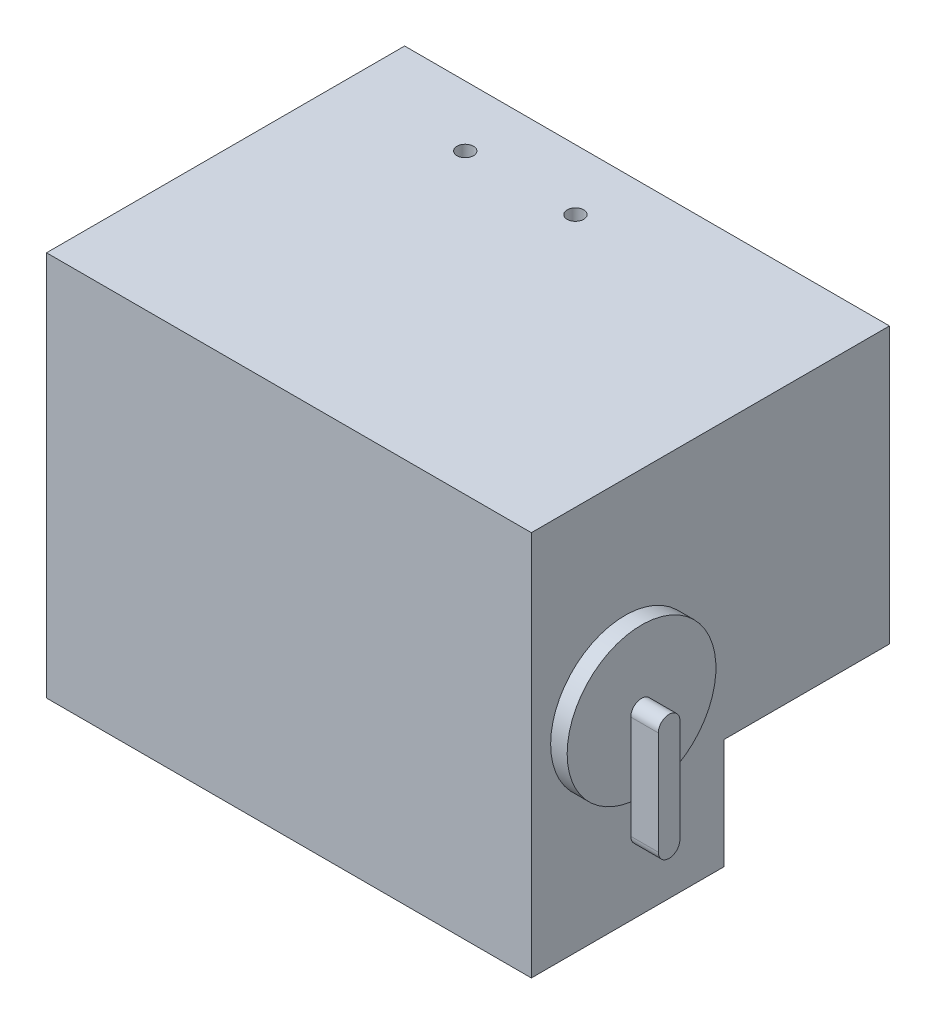
ISO-10303-21;
HEADER;
FILE_DESCRIPTION(('STEP AP214'),'2;1');
FILE_NAME('part.step','',(''),(''),'','','');
FILE_SCHEMA(('AUTOMOTIVE_DESIGN { 1 0 10303 214 1 1 1 1 }'));
ENDSEC;
DATA;
#1=APPLICATION_CONTEXT('core data for automotive mechanical design processes');
#2=APPLICATION_PROTOCOL_DEFINITION('international standard','automotive_design',2000,#1);
#3=PRODUCT_CONTEXT('',#1,'mechanical');
#4=PRODUCT('Part','Part','',(#3));
#5=PRODUCT_RELATED_PRODUCT_CATEGORY('part','',(#4));
#6=PRODUCT_DEFINITION_FORMATION('','',#4);
#7=PRODUCT_DEFINITION_CONTEXT('part definition',#1,'design');
#8=PRODUCT_DEFINITION('design','',#6,#7);
#9=PRODUCT_DEFINITION_SHAPE('','',#8);
#10=(LENGTH_UNIT() NAMED_UNIT(*) SI_UNIT(.MILLI.,.METRE.));
#11=(NAMED_UNIT(*) PLANE_ANGLE_UNIT() SI_UNIT($,.RADIAN.));
#12=(NAMED_UNIT(*) SI_UNIT($,.STERADIAN.) SOLID_ANGLE_UNIT());
#13=UNCERTAINTY_MEASURE_WITH_UNIT(LENGTH_MEASURE(1.E-05),#10,'distance_accuracy_value','');
#14=(GEOMETRIC_REPRESENTATION_CONTEXT(3) GLOBAL_UNCERTAINTY_ASSIGNED_CONTEXT((#13)) GLOBAL_UNIT_ASSIGNED_CONTEXT((#10,
#11,#12)) REPRESENTATION_CONTEXT('',''));
#15=CARTESIAN_POINT('',(0.,0.,0.));
#16=DIRECTION('',(0.,0.,1.));
#17=DIRECTION('',(1.,0.,0.));
#18=AXIS2_PLACEMENT_3D('',#15,#16,#17);
#19=CARTESIAN_POINT('',(47.,0.,18.));
#20=DIRECTION('',(1.,0.,0.));
#21=DIRECTION('',(0.,0.,-1.));
#22=AXIS2_PLACEMENT_3D('',#19,#20,#21);
#23=PLANE('',#22);
#24=CARTESIAN_POINT('',(47.,0.,18.));
#25=DIRECTION('',(1.,0.,0.));
#26=DIRECTION('',(0.,0.,-1.));
#27=AXIS2_PLACEMENT_3D('',#24,#25,#26);
#28=CIRCLE('',#27,1.95720638156463);
#29=CARTESIAN_POINT('',(47.,0.,16.0427936184354));
#30=VERTEX_POINT('',#29);
#31=CARTESIAN_POINT('',(47.,0.,19.9572063815646));
#32=VERTEX_POINT('',#31);
#33=EDGE_CURVE('E62',#30,#32,#28,.T.);
#34=ORIENTED_EDGE('',*,*,#33,.F.);
#35=DIRECTION('',(0.,-1.,0.));
#36=VECTOR('',#35,1.);
#37=CARTESIAN_POINT('',(47.,0.,16.0427936184354));
#38=LINE('',#37,#36);
#39=CARTESIAN_POINT('',(47.,-13.3573703691993,16.0427936184354));
#40=VERTEX_POINT('',#39);
#41=EDGE_CURVE('E147',#30,#40,#38,.T.);
#42=ORIENTED_EDGE('',*,*,#41,.T.);
#43=CARTESIAN_POINT('',(47.,0.,18.));
#44=DIRECTION('',(1.,0.,0.));
#45=DIRECTION('',(0.,0.,-1.));
#46=AXIS2_PLACEMENT_3D('',#43,#44,#45);
#47=CIRCLE('',#46,13.5);
#48=CARTESIAN_POINT('',(47.,-13.3573703691993,19.9572063815646));
#49=VERTEX_POINT('',#48);
#50=EDGE_CURVE('E150',#40,#49,#47,.T.);
#51=ORIENTED_EDGE('',*,*,#50,.T.);
#52=DIRECTION('',(0.,-1.,0.));
#53=VECTOR('',#52,1.);
#54=CARTESIAN_POINT('',(47.,0.,19.9572063815646));
#55=LINE('',#54,#53);
#56=EDGE_CURVE('E67',#32,#49,#55,.T.);
#57=ORIENTED_EDGE('',*,*,#56,.F.);
#58=EDGE_LOOP('',(#34,#42,#51,#57));
#59=FACE_BOUND('',#58,.T.);
#60=ADVANCED_FACE('F47',(#59),#23,.T.);
#61=CARTESIAN_POINT('',(0.,0.,0.));
#62=DIRECTION('',(0.,0.,1.));
#63=DIRECTION('',(1.,0.,0.));
#64=AXIS2_PLACEMENT_3D('',#61,#62,#63);
#65=PLANE('',#64);
#66=DIRECTION('',(-1.,0.,0.));
#67=VECTOR('',#66,1.);
#68=CARTESIAN_POINT('',(44.,-15.,0.));
#69=LINE('',#68,#67);
#70=CARTESIAN_POINT('',(44.,-15.,0.));
#71=VERTEX_POINT('',#70);
#72=CARTESIAN_POINT('',(-44.,-15.,0.));
#73=VERTEX_POINT('',#72);
#74=EDGE_CURVE('E159',#71,#73,#69,.T.);
#75=ORIENTED_EDGE('',*,*,#74,.F.);
#76=DIRECTION('',(0.,1.,0.));
#77=VECTOR('',#76,1.);
#78=CARTESIAN_POINT('',(44.,35.,0.));
#79=LINE('',#78,#77);
#80=CARTESIAN_POINT('',(44.,-35.,0.));
#81=VERTEX_POINT('',#80);
#82=EDGE_CURVE('E179',#81,#71,#79,.T.);
#83=ORIENTED_EDGE('',*,*,#82,.F.);
#84=DIRECTION('',(1.,0.,0.));
#85=VECTOR('',#84,1.);
#86=CARTESIAN_POINT('',(-44.,-35.,0.));
#87=LINE('',#86,#85);
#88=CARTESIAN_POINT('',(-44.,-35.,0.));
#89=VERTEX_POINT('',#88);
#90=EDGE_CURVE('E184',#89,#81,#87,.T.);
#91=ORIENTED_EDGE('',*,*,#90,.F.);
#92=DIRECTION('',(0.,-1.,0.));
#93=VECTOR('',#92,1.);
#94=CARTESIAN_POINT('',(-44.,35.,0.));
#95=LINE('',#94,#93);
#96=EDGE_CURVE('E193',#73,#89,#95,.T.);
#97=ORIENTED_EDGE('',*,*,#96,.F.);
#98=EDGE_LOOP('',(#75,#83,#91,#97));
#99=FACE_BOUND('',#98,.T.);
#100=ADVANCED_FACE('F229',(#99),#65,.F.);
#101=CARTESIAN_POINT('',(44.,35.,35.));
#102=DIRECTION('',(-1.,0.,0.));
#103=DIRECTION('',(0.,0.,1.));
#104=AXIS2_PLACEMENT_3D('',#101,#102,#103);
#105=PLANE('',#104);
#106=CARTESIAN_POINT('',(44.,0.,18.));
#107=DIRECTION('',(-1.,0.,0.));
#108=DIRECTION('',(0.,0.,1.));
#109=AXIS2_PLACEMENT_3D('',#106,#107,#108);
#110=CIRCLE('',#109,13.5);
#111=CARTESIAN_POINT('',(44.,0.,31.5));
#112=VERTEX_POINT('',#111);
#113=EDGE_CURVE('E11',#112,#112,#110,.F.);
#114=ORIENTED_EDGE('',*,*,#113,.F.);
#115=EDGE_LOOP('',(#114));
#116=FACE_BOUND('',#115,.T.);
#117=ORIENTED_EDGE('',*,*,#82,.T.);
#118=DIRECTION('',(0.,0.,1.));
#119=VECTOR('',#118,1.);
#120=CARTESIAN_POINT('',(44.,-15.,-30.));
#121=LINE('',#120,#119);
#122=CARTESIAN_POINT('',(44.,-15.,-30.));
#123=VERTEX_POINT('',#122);
#124=EDGE_CURVE('E176',#123,#71,#121,.T.);
#125=ORIENTED_EDGE('',*,*,#124,.F.);
#126=DIRECTION('',(0.,-1.,0.));
#127=VECTOR('',#126,1.);
#128=CARTESIAN_POINT('',(44.,35.,-30.));
#129=LINE('',#128,#127);
#130=CARTESIAN_POINT('',(44.,35.,-30.));
#131=VERTEX_POINT('',#130);
#132=EDGE_CURVE('E160',#131,#123,#129,.T.);
#133=ORIENTED_EDGE('',*,*,#132,.F.);
#134=DIRECTION('',(0.,0.,-1.));
#135=VECTOR('',#134,1.);
#136=CARTESIAN_POINT('',(44.,35.,35.));
#137=LINE('',#136,#135);
#138=CARTESIAN_POINT('',(44.,35.,35.));
#139=VERTEX_POINT('',#138);
#140=EDGE_CURVE('E55',#139,#131,#137,.T.);
#141=ORIENTED_EDGE('',*,*,#140,.F.);
#142=DIRECTION('',(0.,1.,0.));
#143=VECTOR('',#142,1.);
#144=CARTESIAN_POINT('',(44.,35.,35.));
#145=LINE('',#144,#143);
#146=CARTESIAN_POINT('',(44.,-35.,35.));
#147=VERTEX_POINT('',#146);
#148=EDGE_CURVE('E180',#147,#139,#145,.T.);
#149=ORIENTED_EDGE('',*,*,#148,.F.);
#150=DIRECTION('',(0.,0.,-1.));
#151=VECTOR('',#150,1.);
#152=CARTESIAN_POINT('',(44.,-35.,35.));
#153=LINE('',#152,#151);
#154=EDGE_CURVE('E190',#147,#81,#153,.T.);
#155=ORIENTED_EDGE('',*,*,#154,.T.);
#156=EDGE_LOOP('',(#117,#125,#133,#141,#149,#155));
#157=FACE_BOUND('',#156,.T.);
#158=ADVANCED_FACE('F49',(#116,#157),#105,.F.);
#159=CARTESIAN_POINT('',(-44.,35.,35.));
#160=DIRECTION('',(0.,-1.,0.));
#161=DIRECTION('',(0.,0.,-1.));
#162=AXIS2_PLACEMENT_3D('',#159,#160,#161);
#163=PLANE('',#162);
#164=CARTESIAN_POINT('',(-22.,35.,-19.));
#165=DIRECTION('',(0.,1.,0.));
#166=DIRECTION('',(0.,0.,1.));
#167=AXIS2_PLACEMENT_3D('',#164,#165,#166);
#168=CIRCLE('',#167,1.5);
#169=CARTESIAN_POINT('',(-22.,35.,-17.5));
#170=VERTEX_POINT('',#169);
#171=EDGE_CURVE('E272',#170,#170,#168,.T.);
#172=ORIENTED_EDGE('',*,*,#171,.F.);
#173=EDGE_LOOP('',(#172));
#174=FACE_BOUND('',#173,.T.);
#175=CARTESIAN_POINT('',(-2.00000000000001,35.,-19.));
#176=DIRECTION('',(0.,1.,0.));
#177=DIRECTION('',(0.,0.,1.));
#178=AXIS2_PLACEMENT_3D('',#175,#176,#177);
#179=CIRCLE('',#178,1.5);
#180=CARTESIAN_POINT('',(-2.00000000000001,35.,-17.5));
#181=VERTEX_POINT('',#180);
#182=EDGE_CURVE('E269',#181,#181,#179,.T.);
#183=ORIENTED_EDGE('',*,*,#182,.F.);
#184=EDGE_LOOP('',(#183));
#185=FACE_BOUND('',#184,.T.);
#186=ORIENTED_EDGE('',*,*,#140,.T.);
#187=DIRECTION('',(1.,0.,0.));
#188=VECTOR('',#187,1.);
#189=CARTESIAN_POINT('',(44.,35.,-30.));
#190=LINE('',#189,#188);
#191=CARTESIAN_POINT('',(-44.,35.,-30.));
#192=VERTEX_POINT('',#191);
#193=EDGE_CURVE('E168',#192,#131,#190,.T.);
#194=ORIENTED_EDGE('',*,*,#193,.F.);
#195=DIRECTION('',(0.,0.,-1.));
#196=VECTOR('',#195,1.);
#197=CARTESIAN_POINT('',(-44.,35.,35.));
#198=LINE('',#197,#196);
#199=CARTESIAN_POINT('',(-44.,35.,35.));
#200=VERTEX_POINT('',#199);
#201=EDGE_CURVE('E201',#200,#192,#198,.T.);
#202=ORIENTED_EDGE('',*,*,#201,.F.);
#203=DIRECTION('',(-1.,0.,0.));
#204=VECTOR('',#203,1.);
#205=CARTESIAN_POINT('',(-44.,35.,35.));
#206=LINE('',#205,#204);
#207=EDGE_CURVE('E183',#139,#200,#206,.T.);
#208=ORIENTED_EDGE('',*,*,#207,.F.);
#209=EDGE_LOOP('',(#186,#194,#202,#208));
#210=FACE_BOUND('',#209,.T.);
#211=ADVANCED_FACE('F205',(#174,#185,#210),#163,.F.);
#212=CARTESIAN_POINT('',(-44.,35.,35.));
#213=DIRECTION('',(1.,0.,0.));
#214=DIRECTION('',(0.,0.,-1.));
#215=AXIS2_PLACEMENT_3D('',#212,#213,#214);
#216=PLANE('',#215);
#217=ORIENTED_EDGE('',*,*,#201,.T.);
#218=DIRECTION('',(0.,1.,0.));
#219=VECTOR('',#218,1.);
#220=CARTESIAN_POINT('',(-44.,35.,-30.));
#221=LINE('',#220,#219);
#222=CARTESIAN_POINT('',(-44.,-15.,-30.));
#223=VERTEX_POINT('',#222);
#224=EDGE_CURVE('E165',#223,#192,#221,.T.);
#225=ORIENTED_EDGE('',*,*,#224,.F.);
#226=DIRECTION('',(0.,0.,1.));
#227=VECTOR('',#226,1.);
#228=CARTESIAN_POINT('',(-44.,-15.,-30.));
#229=LINE('',#228,#227);
#230=EDGE_CURVE('E171',#223,#73,#229,.T.);
#231=ORIENTED_EDGE('',*,*,#230,.T.);
#232=ORIENTED_EDGE('',*,*,#96,.T.);
#233=DIRECTION('',(0.,0.,-1.));
#234=VECTOR('',#233,1.);
#235=CARTESIAN_POINT('',(-44.,-35.,35.));
#236=LINE('',#235,#234);
#237=CARTESIAN_POINT('',(-44.,-35.,35.));
#238=VERTEX_POINT('',#237);
#239=EDGE_CURVE('E198',#238,#89,#236,.T.);
#240=ORIENTED_EDGE('',*,*,#239,.F.);
#241=DIRECTION('',(0.,-1.,0.));
#242=VECTOR('',#241,1.);
#243=CARTESIAN_POINT('',(-44.,35.,35.));
#244=LINE('',#243,#242);
#245=EDGE_CURVE('E186',#200,#238,#244,.T.);
#246=ORIENTED_EDGE('',*,*,#245,.F.);
#247=EDGE_LOOP('',(#217,#225,#231,#232,#240,#246));
#248=FACE_BOUND('',#247,.T.);
#249=ADVANCED_FACE('F219',(#248),#216,.F.);
#250=CARTESIAN_POINT('',(-44.,-35.,35.));
#251=DIRECTION('',(0.,1.,0.));
#252=DIRECTION('',(0.,0.,1.));
#253=AXIS2_PLACEMENT_3D('',#250,#251,#252);
#254=PLANE('',#253);
#255=ORIENTED_EDGE('',*,*,#90,.T.);
#256=ORIENTED_EDGE('',*,*,#154,.F.);
#257=DIRECTION('',(1.,0.,0.));
#258=VECTOR('',#257,1.);
#259=CARTESIAN_POINT('',(-44.,-35.,35.));
#260=LINE('',#259,#258);
#261=EDGE_CURVE('E188',#238,#147,#260,.T.);
#262=ORIENTED_EDGE('',*,*,#261,.F.);
#263=ORIENTED_EDGE('',*,*,#239,.T.);
#264=EDGE_LOOP('',(#255,#256,#262,#263));
#265=FACE_BOUND('',#264,.T.);
#266=ADVANCED_FACE('F230',(#265),#254,.F.);
#267=CARTESIAN_POINT('',(0.,0.,35.));
#268=DIRECTION('',(0.,0.,1.));
#269=DIRECTION('',(1.,0.,0.));
#270=AXIS2_PLACEMENT_3D('',#267,#268,#269);
#271=PLANE('',#270);
#272=ORIENTED_EDGE('',*,*,#148,.T.);
#273=ORIENTED_EDGE('',*,*,#207,.T.);
#274=ORIENTED_EDGE('',*,*,#245,.T.);
#275=ORIENTED_EDGE('',*,*,#261,.T.);
#276=EDGE_LOOP('',(#272,#273,#274,#275));
#277=FACE_BOUND('',#276,.T.);
#278=ADVANCED_FACE('F224',(#277),#271,.T.);
#279=CARTESIAN_POINT('',(44.,-15.,-30.));
#280=DIRECTION('',(0.,1.,0.));
#281=DIRECTION('',(0.,0.,1.));
#282=AXIS2_PLACEMENT_3D('',#279,#280,#281);
#283=PLANE('',#282);
#284=CARTESIAN_POINT('',(-22.,-15.,-19.));
#285=DIRECTION('',(0.,1.,0.));
#286=DIRECTION('',(0.,0.,1.));
#287=AXIS2_PLACEMENT_3D('',#284,#285,#286);
#288=CIRCLE('',#287,1.5);
#289=CARTESIAN_POINT('',(-22.,-15.,-17.5));
#290=VERTEX_POINT('',#289);
#291=EDGE_CURVE('E264',#290,#290,#288,.F.);
#292=ORIENTED_EDGE('',*,*,#291,.F.);
#293=EDGE_LOOP('',(#292));
#294=FACE_BOUND('',#293,.T.);
#295=CARTESIAN_POINT('',(-2.00000000000001,-15.,-19.));
#296=DIRECTION('',(0.,1.,0.));
#297=DIRECTION('',(0.,0.,1.));
#298=AXIS2_PLACEMENT_3D('',#295,#296,#297);
#299=CIRCLE('',#298,1.5);
#300=CARTESIAN_POINT('',(-2.00000000000001,-15.,-17.5));
#301=VERTEX_POINT('',#300);
#302=EDGE_CURVE('E267',#301,#301,#299,.F.);
#303=ORIENTED_EDGE('',*,*,#302,.F.);
#304=EDGE_LOOP('',(#303));
#305=FACE_BOUND('',#304,.T.);
#306=ORIENTED_EDGE('',*,*,#74,.T.);
#307=ORIENTED_EDGE('',*,*,#230,.F.);
#308=DIRECTION('',(-1.,0.,0.));
#309=VECTOR('',#308,1.);
#310=CARTESIAN_POINT('',(44.,-15.,-30.));
#311=LINE('',#310,#309);
#312=EDGE_CURVE('E163',#123,#223,#311,.T.);
#313=ORIENTED_EDGE('',*,*,#312,.F.);
#314=ORIENTED_EDGE('',*,*,#124,.T.);
#315=EDGE_LOOP('',(#306,#307,#313,#314));
#316=FACE_BOUND('',#315,.T.);
#317=ADVANCED_FACE('F216',(#294,#305,#316),#283,.F.);
#318=CARTESIAN_POINT('',(0.,0.,-30.));
#319=DIRECTION('',(0.,0.,-1.));
#320=DIRECTION('',(-1.,0.,0.));
#321=AXIS2_PLACEMENT_3D('',#318,#319,#320);
#322=PLANE('',#321);
#323=ORIENTED_EDGE('',*,*,#132,.T.);
#324=ORIENTED_EDGE('',*,*,#312,.T.);
#325=ORIENTED_EDGE('',*,*,#224,.T.);
#326=ORIENTED_EDGE('',*,*,#193,.T.);
#327=EDGE_LOOP('',(#323,#324,#325,#326));
#328=FACE_BOUND('',#327,.T.);
#329=ADVANCED_FACE('F211',(#328),#322,.T.);
#330=CARTESIAN_POINT('',(47.,0.,18.));
#331=DIRECTION('',(-1.,0.,0.));
#332=DIRECTION('',(0.,0.,1.));
#333=AXIS2_PLACEMENT_3D('',#330,#331,#332);
#334=CYLINDRICAL_SURFACE('',#333,13.5);
#335=EDGE_CURVE('E152',#49,#40,#47,.T.);
#336=ORIENTED_EDGE('',*,*,#335,.F.);
#337=ORIENTED_EDGE('',*,*,#50,.F.);
#338=EDGE_LOOP('',(#336,#337));
#339=FACE_BOUND('',#338,.T.);
#340=ORIENTED_EDGE('',*,*,#113,.T.);
#341=EDGE_LOOP('',(#340));
#342=FACE_BOUND('',#341,.T.);
#343=ADVANCED_FACE('F249',(#339,#342),#334,.T.);
#344=CARTESIAN_POINT('',(47.,0.,18.));
#345=DIRECTION('',(1.,0.,0.));
#346=DIRECTION('',(0.,0.,-1.));
#347=AXIS2_PLACEMENT_3D('',#344,#345,#346);
#348=PLANE('',#347);
#349=CARTESIAN_POINT('',(47.,-18.740555957905,19.9572063815646));
#350=VERTEX_POINT('',#349);
#351=EDGE_CURVE('E281',#49,#350,#55,.T.);
#352=ORIENTED_EDGE('',*,*,#351,.F.);
#353=ORIENTED_EDGE('',*,*,#335,.T.);
#354=CARTESIAN_POINT('',(47.,-18.740555957905,16.0427936184354));
#355=VERTEX_POINT('',#354);
#356=EDGE_CURVE('E286',#40,#355,#38,.T.);
#357=ORIENTED_EDGE('',*,*,#356,.T.);
#358=CARTESIAN_POINT('',(47.,-18.740555957905,18.));
#359=DIRECTION('',(1.,0.,0.));
#360=DIRECTION('',(0.,0.,-1.));
#361=AXIS2_PLACEMENT_3D('',#358,#359,#360);
#362=CIRCLE('',#361,1.95720638156463);
#363=EDGE_CURVE('E283',#350,#355,#362,.T.);
#364=ORIENTED_EDGE('',*,*,#363,.F.);
#365=EDGE_LOOP('',(#352,#353,#357,#364));
#366=FACE_BOUND('',#365,.T.);
#367=ADVANCED_FACE('F251',(#366),#348,.F.);
#368=CARTESIAN_POINT('',(52.,0.,18.));
#369=DIRECTION('',(-1.,0.,0.));
#370=DIRECTION('',(0.,0.,1.));
#371=AXIS2_PLACEMENT_3D('',#368,#369,#370);
#372=CYLINDRICAL_SURFACE('',#371,1.95720638156463);
#373=ORIENTED_EDGE('',*,*,#33,.T.);
#374=DIRECTION('',(-1.,0.,0.));
#375=VECTOR('',#374,1.);
#376=CARTESIAN_POINT('',(52.,0.,19.9572063815646));
#377=LINE('',#376,#375);
#378=CARTESIAN_POINT('',(52.,0.,19.9572063815646));
#379=VERTEX_POINT('',#378);
#380=EDGE_CURVE('E133',#379,#32,#377,.T.);
#381=ORIENTED_EDGE('',*,*,#380,.F.);
#382=CARTESIAN_POINT('',(52.,0.,18.));
#383=DIRECTION('',(1.,0.,0.));
#384=DIRECTION('',(0.,0.,-1.));
#385=AXIS2_PLACEMENT_3D('',#382,#383,#384);
#386=CIRCLE('',#385,1.95720638156463);
#387=CARTESIAN_POINT('',(52.,0.,16.0427936184354));
#388=VERTEX_POINT('',#387);
#389=EDGE_CURVE('E139',#388,#379,#386,.T.);
#390=ORIENTED_EDGE('',*,*,#389,.F.);
#391=DIRECTION('',(-1.,0.,0.));
#392=VECTOR('',#391,1.);
#393=CARTESIAN_POINT('',(52.,0.,16.0427936184354));
#394=LINE('',#393,#392);
#395=EDGE_CURVE('E279',#388,#30,#394,.T.);
#396=ORIENTED_EDGE('',*,*,#395,.T.);
#397=EDGE_LOOP('',(#373,#381,#390,#396));
#398=FACE_BOUND('',#397,.T.);
#399=ADVANCED_FACE('F149',(#398),#372,.T.);
#400=CARTESIAN_POINT('',(52.,0.,19.9572063815646));
#401=DIRECTION('',(0.,0.,-1.));
#402=DIRECTION('',(-1.,0.,0.));
#403=AXIS2_PLACEMENT_3D('',#400,#401,#402);
#404=PLANE('',#403);
#405=ORIENTED_EDGE('',*,*,#56,.T.);
#406=ORIENTED_EDGE('',*,*,#351,.T.);
#407=DIRECTION('',(-1.,0.,0.));
#408=VECTOR('',#407,1.);
#409=CARTESIAN_POINT('',(52.,-18.740555957905,19.9572063815646));
#410=LINE('',#409,#408);
#411=CARTESIAN_POINT('',(52.,-18.740555957905,19.9572063815646));
#412=VERTEX_POINT('',#411);
#413=EDGE_CURVE('E135',#412,#350,#410,.T.);
#414=ORIENTED_EDGE('',*,*,#413,.F.);
#415=DIRECTION('',(0.,-1.,0.));
#416=VECTOR('',#415,1.);
#417=CARTESIAN_POINT('',(52.,0.,19.9572063815646));
#418=LINE('',#417,#416);
#419=EDGE_CURVE('E129',#379,#412,#418,.T.);
#420=ORIENTED_EDGE('',*,*,#419,.F.);
#421=ORIENTED_EDGE('',*,*,#380,.T.);
#422=EDGE_LOOP('',(#405,#406,#414,#420,#421));
#423=FACE_BOUND('',#422,.T.);
#424=ADVANCED_FACE('F131',(#423),#404,.F.);
#425=CARTESIAN_POINT('',(52.,-18.740555957905,18.));
#426=DIRECTION('',(-1.,0.,0.));
#427=DIRECTION('',(0.,0.,1.));
#428=AXIS2_PLACEMENT_3D('',#425,#426,#427);
#429=CYLINDRICAL_SURFACE('',#428,1.95720638156463);
#430=ORIENTED_EDGE('',*,*,#363,.T.);
#431=DIRECTION('',(-1.,0.,0.));
#432=VECTOR('',#431,1.);
#433=CARTESIAN_POINT('',(52.,-18.740555957905,16.0427936184354));
#434=LINE('',#433,#432);
#435=CARTESIAN_POINT('',(52.,-18.740555957905,16.0427936184354));
#436=VERTEX_POINT('',#435);
#437=EDGE_CURVE('E154',#436,#355,#434,.T.);
#438=ORIENTED_EDGE('',*,*,#437,.F.);
#439=CARTESIAN_POINT('',(52.,-18.740555957905,18.));
#440=DIRECTION('',(1.,0.,0.));
#441=DIRECTION('',(0.,0.,-1.));
#442=AXIS2_PLACEMENT_3D('',#439,#440,#441);
#443=CIRCLE('',#442,1.95720638156463);
#444=EDGE_CURVE('E138',#412,#436,#443,.T.);
#445=ORIENTED_EDGE('',*,*,#444,.F.);
#446=ORIENTED_EDGE('',*,*,#413,.T.);
#447=EDGE_LOOP('',(#430,#438,#445,#446));
#448=FACE_BOUND('',#447,.T.);
#449=ADVANCED_FACE('F296',(#448),#429,.T.);
#450=CARTESIAN_POINT('',(52.,0.,16.0427936184354));
#451=DIRECTION('',(0.,0.,-1.));
#452=DIRECTION('',(-1.,0.,0.));
#453=AXIS2_PLACEMENT_3D('',#450,#451,#452);
#454=PLANE('',#453);
#455=ORIENTED_EDGE('',*,*,#41,.F.);
#456=ORIENTED_EDGE('',*,*,#395,.F.);
#457=DIRECTION('',(0.,-1.,0.));
#458=VECTOR('',#457,1.);
#459=CARTESIAN_POINT('',(52.,0.,16.0427936184354));
#460=LINE('',#459,#458);
#461=EDGE_CURVE('E145',#388,#436,#460,.T.);
#462=ORIENTED_EDGE('',*,*,#461,.T.);
#463=ORIENTED_EDGE('',*,*,#437,.T.);
#464=ORIENTED_EDGE('',*,*,#356,.F.);
#465=EDGE_LOOP('',(#455,#456,#462,#463,#464));
#466=FACE_BOUND('',#465,.T.);
#467=ADVANCED_FACE('F293',(#466),#454,.T.);
#468=CARTESIAN_POINT('',(52.,0.,18.));
#469=DIRECTION('',(1.,0.,0.));
#470=DIRECTION('',(0.,0.,-1.));
#471=AXIS2_PLACEMENT_3D('',#468,#469,#470);
#472=PLANE('',#471);
#473=ORIENTED_EDGE('',*,*,#389,.T.);
#474=ORIENTED_EDGE('',*,*,#419,.T.);
#475=ORIENTED_EDGE('',*,*,#444,.T.);
#476=ORIENTED_EDGE('',*,*,#461,.F.);
#477=EDGE_LOOP('',(#473,#474,#475,#476));
#478=FACE_BOUND('',#477,.T.);
#479=ADVANCED_FACE('F143',(#478),#472,.T.);
#480=CARTESIAN_POINT('',(-2.00000000000001,-35.001,-19.));
#481=DIRECTION('',(0.,1.,0.));
#482=DIRECTION('',(0.,0.,1.));
#483=AXIS2_PLACEMENT_3D('',#480,#481,#482);
#484=CYLINDRICAL_SURFACE('',#483,1.5);
#485=ORIENTED_EDGE('',*,*,#182,.T.);
#486=EDGE_LOOP('',(#485));
#487=FACE_BOUND('',#486,.T.);
#488=ORIENTED_EDGE('',*,*,#302,.T.);
#489=EDGE_LOOP('',(#488));
#490=FACE_BOUND('',#489,.T.);
#491=ADVANCED_FACE('F316',(#487,#490),#484,.F.);
#492=CARTESIAN_POINT('',(-22.,-35.001,-19.));
#493=DIRECTION('',(0.,1.,0.));
#494=DIRECTION('',(0.,0.,1.));
#495=AXIS2_PLACEMENT_3D('',#492,#493,#494);
#496=CYLINDRICAL_SURFACE('',#495,1.5);
#497=ORIENTED_EDGE('',*,*,#171,.T.);
#498=EDGE_LOOP('',(#497));
#499=FACE_BOUND('',#498,.T.);
#500=ORIENTED_EDGE('',*,*,#291,.T.);
#501=EDGE_LOOP('',(#500));
#502=FACE_BOUND('',#501,.T.);
#503=ADVANCED_FACE('F317',(#499,#502),#496,.F.);
#504=CLOSED_SHELL('',(#60,#100,#158,#211,#249,#266,#278,#317,#329,#343,#367,#399,#424,#449,#467,
#479,#491,#503));
#505=MANIFOLD_SOLID_BREP('B2',#504);
#506=ADVANCED_BREP_SHAPE_REPRESENTATION('',(#18,#505),#14);
#507=SHAPE_DEFINITION_REPRESENTATION(#9,#506);
ENDSEC;
END-ISO-10303-21;
